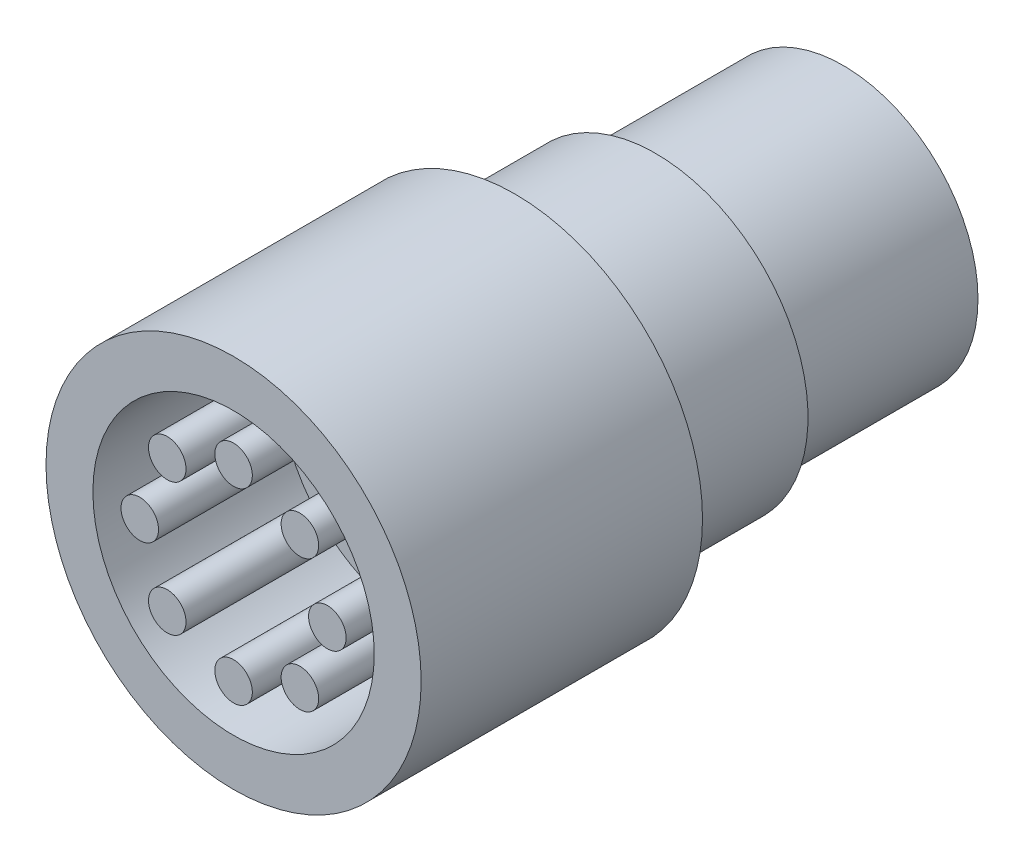
ISO-10303-21;
HEADER;
FILE_DESCRIPTION(('STEP AP214'),'2;1');
FILE_NAME('part.step','',(''),(''),'','','');
FILE_SCHEMA(('AUTOMOTIVE_DESIGN { 1 0 10303 214 1 1 1 1 }'));
ENDSEC;
DATA;
#1=APPLICATION_CONTEXT('core data for automotive mechanical design processes');
#2=APPLICATION_PROTOCOL_DEFINITION('international standard','automotive_design',2000,#1);
#3=PRODUCT_CONTEXT('',#1,'mechanical');
#4=PRODUCT('Part','Part','',(#3));
#5=PRODUCT_RELATED_PRODUCT_CATEGORY('part','',(#4));
#6=PRODUCT_DEFINITION_FORMATION('','',#4);
#7=PRODUCT_DEFINITION_CONTEXT('part definition',#1,'design');
#8=PRODUCT_DEFINITION('design','',#6,#7);
#9=PRODUCT_DEFINITION_SHAPE('','',#8);
#10=(LENGTH_UNIT() NAMED_UNIT(*) SI_UNIT(.MILLI.,.METRE.));
#11=(NAMED_UNIT(*) PLANE_ANGLE_UNIT() SI_UNIT($,.RADIAN.));
#12=(NAMED_UNIT(*) SI_UNIT($,.STERADIAN.) SOLID_ANGLE_UNIT());
#13=UNCERTAINTY_MEASURE_WITH_UNIT(LENGTH_MEASURE(1.E-05),#10,'distance_accuracy_value','');
#14=(GEOMETRIC_REPRESENTATION_CONTEXT(3) GLOBAL_UNCERTAINTY_ASSIGNED_CONTEXT((#13)) GLOBAL_UNIT_ASSIGNED_CONTEXT((#10,
#11,#12)) REPRESENTATION_CONTEXT('',''));
#15=CARTESIAN_POINT('',(0.,0.,0.));
#16=DIRECTION('',(0.,0.,1.));
#17=DIRECTION('',(1.,0.,0.));
#18=AXIS2_PLACEMENT_3D('',#15,#16,#17);
#19=CARTESIAN_POINT('',(-2.,0.,9.00000000000001));
#20=DIRECTION('',(0.,0.,1.));
#21=DIRECTION('',(1.,0.,0.));
#22=AXIS2_PLACEMENT_3D('',#19,#20,#21);
#23=PLANE('',#22);
#24=CARTESIAN_POINT('',(-2.,0.,9.00000000000001));
#25=DIRECTION('',(0.,0.,-1.));
#26=DIRECTION('',(-1.,0.,0.));
#27=AXIS2_PLACEMENT_3D('',#24,#25,#26);
#28=CIRCLE('',#27,0.4);
#29=CARTESIAN_POINT('',(-2.4,0.,9.00000000000001));
#30=VERTEX_POINT('',#29);
#31=EDGE_CURVE('E17',#30,#30,#28,.T.);
#32=ORIENTED_EDGE('',*,*,#31,.F.);
#33=EDGE_LOOP('',(#32));
#34=FACE_BOUND('',#33,.T.);
#35=ADVANCED_FACE('F14',(#34),#23,.T.);
#36=CARTESIAN_POINT('',(0.,-2.,9.00000000000001));
#37=DIRECTION('',(0.,0.,1.));
#38=DIRECTION('',(1.,0.,0.));
#39=AXIS2_PLACEMENT_3D('',#36,#37,#38);
#40=PLANE('',#39);
#41=CARTESIAN_POINT('',(0.,-2.,9.00000000000001));
#42=DIRECTION('',(0.,0.,-1.));
#43=DIRECTION('',(-1.,0.,0.));
#44=AXIS2_PLACEMENT_3D('',#41,#42,#43);
#45=CIRCLE('',#44,0.4);
#46=CARTESIAN_POINT('',(-0.4,-2.,9.00000000000001));
#47=VERTEX_POINT('',#46);
#48=EDGE_CURVE('E110',#47,#47,#45,.T.);
#49=ORIENTED_EDGE('',*,*,#48,.F.);
#50=EDGE_LOOP('',(#49));
#51=FACE_BOUND('',#50,.T.);
#52=ADVANCED_FACE('F123',(#51),#40,.T.);
#53=CARTESIAN_POINT('',(2.,0.,9.00000000000001));
#54=DIRECTION('',(0.,0.,1.));
#55=DIRECTION('',(1.,0.,0.));
#56=AXIS2_PLACEMENT_3D('',#53,#54,#55);
#57=PLANE('',#56);
#58=CARTESIAN_POINT('',(2.,0.,9.00000000000001));
#59=DIRECTION('',(0.,0.,-1.));
#60=DIRECTION('',(-1.,0.,0.));
#61=AXIS2_PLACEMENT_3D('',#58,#59,#60);
#62=CIRCLE('',#61,0.4);
#63=CARTESIAN_POINT('',(1.6,0.,9.00000000000001));
#64=VERTEX_POINT('',#63);
#65=EDGE_CURVE('E107',#64,#64,#62,.T.);
#66=ORIENTED_EDGE('',*,*,#65,.F.);
#67=EDGE_LOOP('',(#66));
#68=FACE_BOUND('',#67,.T.);
#69=ADVANCED_FACE('F130',(#68),#57,.T.);
#70=CARTESIAN_POINT('',(0.,2.,9.00000000000001));
#71=DIRECTION('',(0.,0.,1.));
#72=DIRECTION('',(1.,0.,0.));
#73=AXIS2_PLACEMENT_3D('',#70,#71,#72);
#74=PLANE('',#73);
#75=CARTESIAN_POINT('',(0.,2.,9.00000000000001));
#76=DIRECTION('',(0.,0.,-1.));
#77=DIRECTION('',(-1.,0.,0.));
#78=AXIS2_PLACEMENT_3D('',#75,#76,#77);
#79=CIRCLE('',#78,0.4);
#80=CARTESIAN_POINT('',(-0.4,2.,9.00000000000001));
#81=VERTEX_POINT('',#80);
#82=EDGE_CURVE('E103',#81,#81,#79,.T.);
#83=ORIENTED_EDGE('',*,*,#82,.F.);
#84=EDGE_LOOP('',(#83));
#85=FACE_BOUND('',#84,.T.);
#86=ADVANCED_FACE('F216',(#85),#74,.T.);
#87=CARTESIAN_POINT('',(1.4142135623731,1.41421356237309,9.00000000000001));
#88=DIRECTION('',(0.,0.,1.));
#89=DIRECTION('',(1.,0.,0.));
#90=AXIS2_PLACEMENT_3D('',#87,#88,#89);
#91=PLANE('',#90);
#92=CARTESIAN_POINT('',(1.4142135623731,1.41421356237309,9.00000000000001));
#93=DIRECTION('',(0.,0.,-1.));
#94=DIRECTION('',(-1.,0.,0.));
#95=AXIS2_PLACEMENT_3D('',#92,#93,#94);
#96=CIRCLE('',#95,0.4);
#97=CARTESIAN_POINT('',(1.0142135623731,1.41421356237309,9.00000000000001));
#98=VERTEX_POINT('',#97);
#99=EDGE_CURVE('E99',#98,#98,#96,.T.);
#100=ORIENTED_EDGE('',*,*,#99,.F.);
#101=EDGE_LOOP('',(#100));
#102=FACE_BOUND('',#101,.T.);
#103=ADVANCED_FACE('F212',(#102),#91,.T.);
#104=CARTESIAN_POINT('',(1.41421356237309,-1.4142135623731,9.00000000000001));
#105=DIRECTION('',(0.,0.,1.));
#106=DIRECTION('',(1.,0.,0.));
#107=AXIS2_PLACEMENT_3D('',#104,#105,#106);
#108=PLANE('',#107);
#109=CARTESIAN_POINT('',(1.41421356237309,-1.4142135623731,9.00000000000001));
#110=DIRECTION('',(0.,0.,-1.));
#111=DIRECTION('',(-1.,0.,0.));
#112=AXIS2_PLACEMENT_3D('',#109,#110,#111);
#113=CIRCLE('',#112,0.4);
#114=CARTESIAN_POINT('',(1.01421356237309,-1.4142135623731,9.00000000000001));
#115=VERTEX_POINT('',#114);
#116=EDGE_CURVE('E95',#115,#115,#113,.T.);
#117=ORIENTED_EDGE('',*,*,#116,.F.);
#118=EDGE_LOOP('',(#117));
#119=FACE_BOUND('',#118,.T.);
#120=ADVANCED_FACE('F208',(#119),#108,.T.);
#121=CARTESIAN_POINT('',(-1.41421356237311,-1.41421356237308,9.00000000000001));
#122=DIRECTION('',(0.,0.,1.));
#123=DIRECTION('',(1.,0.,0.));
#124=AXIS2_PLACEMENT_3D('',#121,#122,#123);
#125=PLANE('',#124);
#126=CARTESIAN_POINT('',(-1.41421356237311,-1.41421356237308,9.00000000000001));
#127=DIRECTION('',(0.,0.,-1.));
#128=DIRECTION('',(-1.,0.,0.));
#129=AXIS2_PLACEMENT_3D('',#126,#127,#128);
#130=CIRCLE('',#129,0.4);
#131=CARTESIAN_POINT('',(-1.81421356237311,-1.41421356237308,9.00000000000001));
#132=VERTEX_POINT('',#131);
#133=EDGE_CURVE('E92',#132,#132,#130,.T.);
#134=ORIENTED_EDGE('',*,*,#133,.F.);
#135=EDGE_LOOP('',(#134));
#136=FACE_BOUND('',#135,.T.);
#137=ADVANCED_FACE('F204',(#136),#125,.T.);
#138=CARTESIAN_POINT('',(-1.41421356237308,1.41421356237311,9.00000000000001));
#139=DIRECTION('',(0.,0.,1.));
#140=DIRECTION('',(1.,0.,0.));
#141=AXIS2_PLACEMENT_3D('',#138,#139,#140);
#142=PLANE('',#141);
#143=CARTESIAN_POINT('',(-1.41421356237308,1.41421356237311,9.00000000000001));
#144=DIRECTION('',(0.,0.,-1.));
#145=DIRECTION('',(-1.,0.,0.));
#146=AXIS2_PLACEMENT_3D('',#143,#144,#145);
#147=CIRCLE('',#146,0.4);
#148=CARTESIAN_POINT('',(-1.81421356237308,1.41421356237311,9.00000000000001));
#149=VERTEX_POINT('',#148);
#150=EDGE_CURVE('E88',#149,#149,#147,.T.);
#151=ORIENTED_EDGE('',*,*,#150,.F.);
#152=EDGE_LOOP('',(#151));
#153=FACE_BOUND('',#152,.T.);
#154=ADVANCED_FACE('F200',(#153),#142,.T.);
#155=CARTESIAN_POINT('',(0.,0.,-4.));
#156=DIRECTION('',(0.,0.,-1.));
#157=DIRECTION('',(-1.,0.,0.));
#158=AXIS2_PLACEMENT_3D('',#155,#156,#157);
#159=PLANE('',#158);
#160=CARTESIAN_POINT('',(0.,0.,-4.));
#161=DIRECTION('',(0.,0.,1.));
#162=DIRECTION('',(1.,0.,0.));
#163=AXIS2_PLACEMENT_3D('',#160,#161,#162);
#164=CIRCLE('',#163,2.875);
#165=CARTESIAN_POINT('',(2.875,0.,-4.));
#166=VERTEX_POINT('',#165);
#167=EDGE_CURVE('E84',#166,#166,#164,.T.);
#168=ORIENTED_EDGE('',*,*,#167,.F.);
#169=EDGE_LOOP('',(#168));
#170=FACE_BOUND('',#169,.T.);
#171=ADVANCED_FACE('F197',(#170),#159,.T.);
#172=CARTESIAN_POINT('',(-2.,0.,9.00000000000001));
#173=DIRECTION('',(0.,0.,-1.));
#174=DIRECTION('',(-1.,0.,0.));
#175=AXIS2_PLACEMENT_3D('',#172,#173,#174);
#176=CYLINDRICAL_SURFACE('',#175,0.4);
#177=ORIENTED_EDGE('',*,*,#31,.T.);
#178=EDGE_LOOP('',(#177));
#179=FACE_BOUND('',#178,.T.);
#180=CARTESIAN_POINT('',(-2.,0.,5.));
#181=DIRECTION('',(0.,0.,-1.));
#182=DIRECTION('',(-1.,0.,0.));
#183=AXIS2_PLACEMENT_3D('',#180,#181,#182);
#184=CIRCLE('',#183,0.4);
#185=CARTESIAN_POINT('',(-2.4,0.,5.));
#186=VERTEX_POINT('',#185);
#187=EDGE_CURVE('E80',#186,#186,#184,.T.);
#188=ORIENTED_EDGE('',*,*,#187,.F.);
#189=EDGE_LOOP('',(#188));
#190=FACE_BOUND('',#189,.T.);
#191=ADVANCED_FACE('F119',(#179,#190),#176,.T.);
#192=CARTESIAN_POINT('',(0.,-2.,9.00000000000001));
#193=DIRECTION('',(0.,0.,-1.));
#194=DIRECTION('',(-1.,0.,0.));
#195=AXIS2_PLACEMENT_3D('',#192,#193,#194);
#196=CYLINDRICAL_SURFACE('',#195,0.4);
#197=ORIENTED_EDGE('',*,*,#48,.T.);
#198=EDGE_LOOP('',(#197));
#199=FACE_BOUND('',#198,.T.);
#200=CARTESIAN_POINT('',(0.,-2.,5.));
#201=DIRECTION('',(0.,0.,-1.));
#202=DIRECTION('',(-1.,0.,0.));
#203=AXIS2_PLACEMENT_3D('',#200,#201,#202);
#204=CIRCLE('',#203,0.4);
#205=CARTESIAN_POINT('',(-0.4,-2.,5.));
#206=VERTEX_POINT('',#205);
#207=EDGE_CURVE('E76',#206,#206,#204,.T.);
#208=ORIENTED_EDGE('',*,*,#207,.F.);
#209=EDGE_LOOP('',(#208));
#210=FACE_BOUND('',#209,.T.);
#211=ADVANCED_FACE('F191',(#199,#210),#196,.T.);
#212=CARTESIAN_POINT('',(2.,0.,9.00000000000001));
#213=DIRECTION('',(0.,0.,-1.));
#214=DIRECTION('',(-1.,0.,0.));
#215=AXIS2_PLACEMENT_3D('',#212,#213,#214);
#216=CYLINDRICAL_SURFACE('',#215,0.4);
#217=ORIENTED_EDGE('',*,*,#65,.T.);
#218=EDGE_LOOP('',(#217));
#219=FACE_BOUND('',#218,.T.);
#220=CARTESIAN_POINT('',(2.,0.,5.));
#221=DIRECTION('',(0.,0.,-1.));
#222=DIRECTION('',(-1.,0.,0.));
#223=AXIS2_PLACEMENT_3D('',#220,#221,#222);
#224=CIRCLE('',#223,0.4);
#225=CARTESIAN_POINT('',(1.6,0.,5.));
#226=VERTEX_POINT('',#225);
#227=EDGE_CURVE('E72',#226,#226,#224,.T.);
#228=ORIENTED_EDGE('',*,*,#227,.F.);
#229=EDGE_LOOP('',(#228));
#230=FACE_BOUND('',#229,.T.);
#231=ADVANCED_FACE('F187',(#219,#230),#216,.T.);
#232=CARTESIAN_POINT('',(0.,2.,9.00000000000001));
#233=DIRECTION('',(0.,0.,-1.));
#234=DIRECTION('',(-1.,0.,0.));
#235=AXIS2_PLACEMENT_3D('',#232,#233,#234);
#236=CYLINDRICAL_SURFACE('',#235,0.4);
#237=ORIENTED_EDGE('',*,*,#82,.T.);
#238=EDGE_LOOP('',(#237));
#239=FACE_BOUND('',#238,.T.);
#240=CARTESIAN_POINT('',(0.,2.,5.));
#241=DIRECTION('',(0.,0.,-1.));
#242=DIRECTION('',(-1.,0.,0.));
#243=AXIS2_PLACEMENT_3D('',#240,#241,#242);
#244=CIRCLE('',#243,0.4);
#245=CARTESIAN_POINT('',(-0.4,2.,5.));
#246=VERTEX_POINT('',#245);
#247=EDGE_CURVE('E68',#246,#246,#244,.T.);
#248=ORIENTED_EDGE('',*,*,#247,.F.);
#249=EDGE_LOOP('',(#248));
#250=FACE_BOUND('',#249,.T.);
#251=ADVANCED_FACE('F183',(#239,#250),#236,.T.);
#252=CARTESIAN_POINT('',(1.4142135623731,1.41421356237309,9.00000000000001));
#253=DIRECTION('',(0.,0.,-1.));
#254=DIRECTION('',(-1.,0.,0.));
#255=AXIS2_PLACEMENT_3D('',#252,#253,#254);
#256=CYLINDRICAL_SURFACE('',#255,0.4);
#257=ORIENTED_EDGE('',*,*,#99,.T.);
#258=EDGE_LOOP('',(#257));
#259=FACE_BOUND('',#258,.T.);
#260=CARTESIAN_POINT('',(1.4142135623731,1.41421356237309,5.));
#261=DIRECTION('',(0.,0.,-1.));
#262=DIRECTION('',(-1.,0.,0.));
#263=AXIS2_PLACEMENT_3D('',#260,#261,#262);
#264=CIRCLE('',#263,0.4);
#265=CARTESIAN_POINT('',(1.0142135623731,1.41421356237309,5.));
#266=VERTEX_POINT('',#265);
#267=EDGE_CURVE('E64',#266,#266,#264,.T.);
#268=ORIENTED_EDGE('',*,*,#267,.F.);
#269=EDGE_LOOP('',(#268));
#270=FACE_BOUND('',#269,.T.);
#271=ADVANCED_FACE('F179',(#259,#270),#256,.T.);
#272=CARTESIAN_POINT('',(1.41421356237309,-1.4142135623731,9.00000000000001));
#273=DIRECTION('',(0.,0.,-1.));
#274=DIRECTION('',(-1.,0.,0.));
#275=AXIS2_PLACEMENT_3D('',#272,#273,#274);
#276=CYLINDRICAL_SURFACE('',#275,0.4);
#277=ORIENTED_EDGE('',*,*,#116,.T.);
#278=EDGE_LOOP('',(#277));
#279=FACE_BOUND('',#278,.T.);
#280=CARTESIAN_POINT('',(1.41421356237309,-1.4142135623731,5.));
#281=DIRECTION('',(0.,0.,-1.));
#282=DIRECTION('',(-1.,0.,0.));
#283=AXIS2_PLACEMENT_3D('',#280,#281,#282);
#284=CIRCLE('',#283,0.4);
#285=CARTESIAN_POINT('',(1.01421356237309,-1.4142135623731,5.));
#286=VERTEX_POINT('',#285);
#287=EDGE_CURVE('E60',#286,#286,#284,.T.);
#288=ORIENTED_EDGE('',*,*,#287,.F.);
#289=EDGE_LOOP('',(#288));
#290=FACE_BOUND('',#289,.T.);
#291=ADVANCED_FACE('F175',(#279,#290),#276,.T.);
#292=CARTESIAN_POINT('',(-1.41421356237311,-1.41421356237308,9.00000000000001));
#293=DIRECTION('',(0.,0.,-1.));
#294=DIRECTION('',(-1.,0.,0.));
#295=AXIS2_PLACEMENT_3D('',#292,#293,#294);
#296=CYLINDRICAL_SURFACE('',#295,0.4);
#297=ORIENTED_EDGE('',*,*,#133,.T.);
#298=EDGE_LOOP('',(#297));
#299=FACE_BOUND('',#298,.T.);
#300=CARTESIAN_POINT('',(-1.41421356237311,-1.41421356237308,5.));
#301=DIRECTION('',(0.,0.,-1.));
#302=DIRECTION('',(-1.,0.,0.));
#303=AXIS2_PLACEMENT_3D('',#300,#301,#302);
#304=CIRCLE('',#303,0.4);
#305=CARTESIAN_POINT('',(-1.81421356237311,-1.41421356237308,5.));
#306=VERTEX_POINT('',#305);
#307=EDGE_CURVE('E56',#306,#306,#304,.T.);
#308=ORIENTED_EDGE('',*,*,#307,.F.);
#309=EDGE_LOOP('',(#308));
#310=FACE_BOUND('',#309,.T.);
#311=ADVANCED_FACE('F171',(#299,#310),#296,.T.);
#312=CARTESIAN_POINT('',(-1.41421356237308,1.41421356237311,9.00000000000001));
#313=DIRECTION('',(0.,0.,-1.));
#314=DIRECTION('',(-1.,0.,0.));
#315=AXIS2_PLACEMENT_3D('',#312,#313,#314);
#316=CYLINDRICAL_SURFACE('',#315,0.4);
#317=ORIENTED_EDGE('',*,*,#150,.T.);
#318=EDGE_LOOP('',(#317));
#319=FACE_BOUND('',#318,.T.);
#320=CARTESIAN_POINT('',(-1.41421356237308,1.41421356237311,5.));
#321=DIRECTION('',(0.,0.,-1.));
#322=DIRECTION('',(-1.,0.,0.));
#323=AXIS2_PLACEMENT_3D('',#320,#321,#322);
#324=CIRCLE('',#323,0.4);
#325=CARTESIAN_POINT('',(-1.81421356237308,1.41421356237311,5.));
#326=VERTEX_POINT('',#325);
#327=EDGE_CURVE('E52',#326,#326,#324,.T.);
#328=ORIENTED_EDGE('',*,*,#327,.F.);
#329=EDGE_LOOP('',(#328));
#330=FACE_BOUND('',#329,.T.);
#331=ADVANCED_FACE('F167',(#319,#330),#316,.T.);
#332=CARTESIAN_POINT('',(0.,0.,-4.));
#333=DIRECTION('',(0.,0.,1.));
#334=DIRECTION('',(1.,0.,0.));
#335=AXIS2_PLACEMENT_3D('',#332,#333,#334);
#336=CYLINDRICAL_SURFACE('',#335,2.875);
#337=ORIENTED_EDGE('',*,*,#167,.T.);
#338=EDGE_LOOP('',(#337));
#339=FACE_BOUND('',#338,.T.);
#340=CARTESIAN_POINT('',(0.,0.,0.));
#341=DIRECTION('',(0.,0.,1.));
#342=DIRECTION('',(1.,0.,0.));
#343=AXIS2_PLACEMENT_3D('',#340,#341,#342);
#344=CIRCLE('',#343,2.875);
#345=CARTESIAN_POINT('',(2.875,0.,0.));
#346=VERTEX_POINT('',#345);
#347=EDGE_CURVE('E48',#346,#346,#344,.F.);
#348=ORIENTED_EDGE('',*,*,#347,.T.);
#349=EDGE_LOOP('',(#348));
#350=FACE_BOUND('',#349,.T.);
#351=ADVANCED_FACE('F163',(#339,#350),#336,.T.);
#352=CARTESIAN_POINT('',(0.,0.,5.));
#353=DIRECTION('',(0.,0.,1.));
#354=DIRECTION('',(1.,0.,0.));
#355=AXIS2_PLACEMENT_3D('',#352,#353,#354);
#356=PLANE('',#355);
#357=ORIENTED_EDGE('',*,*,#327,.T.);
#358=EDGE_LOOP('',(#357));
#359=FACE_BOUND('',#358,.T.);
#360=ORIENTED_EDGE('',*,*,#307,.T.);
#361=EDGE_LOOP('',(#360));
#362=FACE_BOUND('',#361,.T.);
#363=ORIENTED_EDGE('',*,*,#287,.T.);
#364=EDGE_LOOP('',(#363));
#365=FACE_BOUND('',#364,.T.);
#366=ORIENTED_EDGE('',*,*,#267,.T.);
#367=EDGE_LOOP('',(#366));
#368=FACE_BOUND('',#367,.T.);
#369=CARTESIAN_POINT('',(0.,0.,5.));
#370=DIRECTION('',(0.,0.,1.));
#371=DIRECTION('',(1.,0.,0.));
#372=AXIS2_PLACEMENT_3D('',#369,#370,#371);
#373=CIRCLE('',#372,3.);
#374=CARTESIAN_POINT('',(3.,0.,5.));
#375=VERTEX_POINT('',#374);
#376=EDGE_CURVE('E44',#375,#375,#373,.T.);
#377=ORIENTED_EDGE('',*,*,#376,.T.);
#378=EDGE_LOOP('',(#377));
#379=FACE_BOUND('',#378,.T.);
#380=ORIENTED_EDGE('',*,*,#247,.T.);
#381=EDGE_LOOP('',(#380));
#382=FACE_BOUND('',#381,.T.);
#383=ORIENTED_EDGE('',*,*,#227,.T.);
#384=EDGE_LOOP('',(#383));
#385=FACE_BOUND('',#384,.T.);
#386=ORIENTED_EDGE('',*,*,#207,.T.);
#387=EDGE_LOOP('',(#386));
#388=FACE_BOUND('',#387,.T.);
#389=ORIENTED_EDGE('',*,*,#187,.T.);
#390=EDGE_LOOP('',(#389));
#391=FACE_BOUND('',#390,.T.);
#392=ADVANCED_FACE('F159',(#359,#362,#365,#368,#379,#382,#385,#388,#391),#356,.T.);
#393=CARTESIAN_POINT('',(0.,0.,0.));
#394=DIRECTION('',(0.,0.,1.));
#395=DIRECTION('',(1.,0.,0.));
#396=AXIS2_PLACEMENT_3D('',#393,#394,#395);
#397=PLANE('',#396);
#398=ORIENTED_EDGE('',*,*,#347,.F.);
#399=EDGE_LOOP('',(#398));
#400=FACE_BOUND('',#399,.T.);
#401=CARTESIAN_POINT('',(0.,0.,0.));
#402=DIRECTION('',(0.,0.,-1.));
#403=DIRECTION('',(-1.,0.,0.));
#404=AXIS2_PLACEMENT_3D('',#401,#402,#403);
#405=CIRCLE('',#404,3.25);
#406=CARTESIAN_POINT('',(-3.25,0.,0.));
#407=VERTEX_POINT('',#406);
#408=EDGE_CURVE('E41',#407,#407,#405,.F.);
#409=ORIENTED_EDGE('',*,*,#408,.F.);
#410=EDGE_LOOP('',(#409));
#411=FACE_BOUND('',#410,.T.);
#412=ADVANCED_FACE('F155',(#400,#411),#397,.F.);
#413=CARTESIAN_POINT('',(0.,0.,5.));
#414=DIRECTION('',(0.,0.,1.));
#415=DIRECTION('',(1.,0.,0.));
#416=AXIS2_PLACEMENT_3D('',#413,#414,#415);
#417=CYLINDRICAL_SURFACE('',#416,3.);
#418=ORIENTED_EDGE('',*,*,#376,.F.);
#419=EDGE_LOOP('',(#418));
#420=FACE_BOUND('',#419,.T.);
#421=CARTESIAN_POINT('',(0.,0.,9.00000000000001));
#422=DIRECTION('',(0.,0.,1.));
#423=DIRECTION('',(1.,0.,0.));
#424=AXIS2_PLACEMENT_3D('',#421,#422,#423);
#425=CIRCLE('',#424,3.);
#426=CARTESIAN_POINT('',(3.,0.,9.00000000000001));
#427=VERTEX_POINT('',#426);
#428=EDGE_CURVE('E37',#427,#427,#425,.F.);
#429=ORIENTED_EDGE('',*,*,#428,.F.);
#430=EDGE_LOOP('',(#429));
#431=FACE_BOUND('',#430,.T.);
#432=ADVANCED_FACE('F151',(#420,#431),#417,.F.);
#433=CARTESIAN_POINT('',(0.,0.,3.));
#434=DIRECTION('',(0.,0.,-1.));
#435=DIRECTION('',(-1.,0.,0.));
#436=AXIS2_PLACEMENT_3D('',#433,#434,#435);
#437=CYLINDRICAL_SURFACE('',#436,3.25);
#438=ORIENTED_EDGE('',*,*,#408,.T.);
#439=EDGE_LOOP('',(#438));
#440=FACE_BOUND('',#439,.T.);
#441=CARTESIAN_POINT('',(0.,0.,3.));
#442=DIRECTION('',(0.,0.,-1.));
#443=DIRECTION('',(-1.,0.,0.));
#444=AXIS2_PLACEMENT_3D('',#441,#442,#443);
#445=CIRCLE('',#444,3.25);
#446=CARTESIAN_POINT('',(-3.25,0.,3.));
#447=VERTEX_POINT('',#446);
#448=EDGE_CURVE('E31',#447,#447,#445,.F.);
#449=ORIENTED_EDGE('',*,*,#448,.F.);
#450=EDGE_LOOP('',(#449));
#451=FACE_BOUND('',#450,.T.);
#452=ADVANCED_FACE('F147',(#440,#451),#437,.T.);
#453=CARTESIAN_POINT('',(0.,0.,9.00000000000001));
#454=DIRECTION('',(0.,0.,1.));
#455=DIRECTION('',(1.,0.,0.));
#456=AXIS2_PLACEMENT_3D('',#453,#454,#455);
#457=PLANE('',#456);
#458=CARTESIAN_POINT('',(0.,0.,9.00000000000001));
#459=DIRECTION('',(0.,0.,-1.));
#460=DIRECTION('',(-1.,0.,0.));
#461=AXIS2_PLACEMENT_3D('',#458,#459,#460);
#462=CIRCLE('',#461,4.);
#463=CARTESIAN_POINT('',(-4.,0.,9.00000000000001));
#464=VERTEX_POINT('',#463);
#465=EDGE_CURVE('E22',#464,#464,#462,.T.);
#466=ORIENTED_EDGE('',*,*,#465,.F.);
#467=EDGE_LOOP('',(#466));
#468=FACE_BOUND('',#467,.T.);
#469=ORIENTED_EDGE('',*,*,#428,.T.);
#470=EDGE_LOOP('',(#469));
#471=FACE_BOUND('',#470,.T.);
#472=ADVANCED_FACE('F140',(#468,#471),#457,.T.);
#473=CARTESIAN_POINT('',(0.,0.,3.));
#474=DIRECTION('',(0.,0.,-1.));
#475=DIRECTION('',(-1.,0.,0.));
#476=AXIS2_PLACEMENT_3D('',#473,#474,#475);
#477=PLANE('',#476);
#478=CARTESIAN_POINT('',(0.,0.,3.));
#479=DIRECTION('',(0.,0.,-1.));
#480=DIRECTION('',(-1.,0.,0.));
#481=AXIS2_PLACEMENT_3D('',#478,#479,#480);
#482=CIRCLE('',#481,4.);
#483=CARTESIAN_POINT('',(-4.,0.,3.));
#484=VERTEX_POINT('',#483);
#485=EDGE_CURVE('E10',#484,#484,#482,.F.);
#486=ORIENTED_EDGE('',*,*,#485,.F.);
#487=EDGE_LOOP('',(#486));
#488=FACE_BOUND('',#487,.T.);
#489=ORIENTED_EDGE('',*,*,#448,.T.);
#490=EDGE_LOOP('',(#489));
#491=FACE_BOUND('',#490,.T.);
#492=ADVANCED_FACE('F134',(#488,#491),#477,.T.);
#493=CARTESIAN_POINT('',(0.,0.,9.00000000000001));
#494=DIRECTION('',(0.,0.,-1.));
#495=DIRECTION('',(-1.,0.,0.));
#496=AXIS2_PLACEMENT_3D('',#493,#494,#495);
#497=CYLINDRICAL_SURFACE('',#496,4.);
#498=ORIENTED_EDGE('',*,*,#485,.T.);
#499=EDGE_LOOP('',(#498));
#500=FACE_BOUND('',#499,.T.);
#501=ORIENTED_EDGE('',*,*,#465,.T.);
#502=EDGE_LOOP('',(#501));
#503=FACE_BOUND('',#502,.T.);
#504=ADVANCED_FACE('F132',(#500,#503),#497,.T.);
#505=CLOSED_SHELL('',(#35,#52,#69,#86,#103,#120,#137,#154,#171,#191,#211,#231,#251,#271,#291,
#311,#331,#351,#392,#412,#432,#452,#472,#492,#504));
#506=MANIFOLD_SOLID_BREP('B1',#505);
#507=ADVANCED_BREP_SHAPE_REPRESENTATION('',(#18,#506),#14);
#508=SHAPE_DEFINITION_REPRESENTATION(#9,#507);
ENDSEC;
END-ISO-10303-21;
